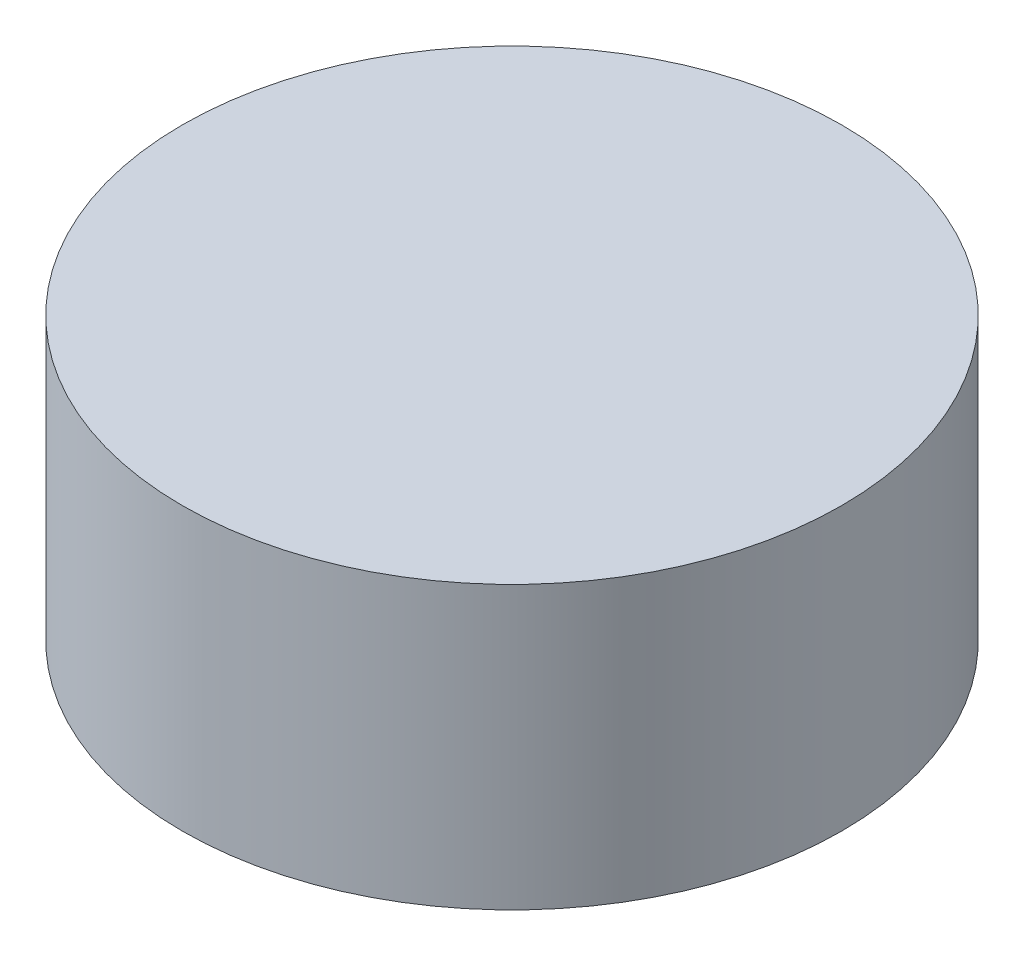
ISO-10303-21;
HEADER;
FILE_DESCRIPTION(('STEP AP214'),'2;1');
FILE_NAME('part.step','',(''),(''),'','','');
FILE_SCHEMA(('AUTOMOTIVE_DESIGN { 1 0 10303 214 1 1 1 1 }'));
ENDSEC;
DATA;
#1=APPLICATION_CONTEXT('core data for automotive mechanical design processes');
#2=APPLICATION_PROTOCOL_DEFINITION('international standard','automotive_design',2000,#1);
#3=PRODUCT_CONTEXT('',#1,'mechanical');
#4=PRODUCT('Part','Part','',(#3));
#5=PRODUCT_RELATED_PRODUCT_CATEGORY('part','',(#4));
#6=PRODUCT_DEFINITION_FORMATION('','',#4);
#7=PRODUCT_DEFINITION_CONTEXT('part definition',#1,'design');
#8=PRODUCT_DEFINITION('design','',#6,#7);
#9=PRODUCT_DEFINITION_SHAPE('','',#8);
#10=(LENGTH_UNIT() NAMED_UNIT(*) SI_UNIT(.MILLI.,.METRE.));
#11=(NAMED_UNIT(*) PLANE_ANGLE_UNIT() SI_UNIT($,.RADIAN.));
#12=(NAMED_UNIT(*) SI_UNIT($,.STERADIAN.) SOLID_ANGLE_UNIT());
#13=UNCERTAINTY_MEASURE_WITH_UNIT(LENGTH_MEASURE(1.E-05),#10,'distance_accuracy_value','');
#14=(GEOMETRIC_REPRESENTATION_CONTEXT(3) GLOBAL_UNCERTAINTY_ASSIGNED_CONTEXT((#13)) GLOBAL_UNIT_ASSIGNED_CONTEXT((#10,
#11,#12)) REPRESENTATION_CONTEXT('',''));
#15=CARTESIAN_POINT('',(0.,0.,0.));
#16=DIRECTION('',(0.,0.,1.));
#17=DIRECTION('',(1.,0.,0.));
#18=AXIS2_PLACEMENT_3D('',#15,#16,#17);
#19=CARTESIAN_POINT('',(-7.391,11.731,-11.173));
#20=DIRECTION('',(0.,-1.,0.));
#21=DIRECTION('',(0.,0.,-1.));
#22=AXIS2_PLACEMENT_3D('',#19,#20,#21);
#23=CYLINDRICAL_SURFACE('',#22,13.719);
#24=CARTESIAN_POINT('',(-7.391,11.731,-11.173));
#25=DIRECTION('',(0.,1.,0.));
#26=DIRECTION('',(0.,0.,1.));
#27=AXIS2_PLACEMENT_3D('',#24,#25,#26);
#28=CIRCLE('',#27,13.719);
#29=CARTESIAN_POINT('',(-7.391,11.731,2.546));
#30=VERTEX_POINT('',#29);
#31=EDGE_CURVE('E10',#30,#30,#28,.T.);
#32=ORIENTED_EDGE('',*,*,#31,.F.);
#33=EDGE_LOOP('',(#32));
#34=FACE_BOUND('',#33,.T.);
#35=CARTESIAN_POINT('',(-7.391,0.,-11.173));
#36=DIRECTION('',(0.,1.,0.));
#37=DIRECTION('',(0.,0.,1.));
#38=AXIS2_PLACEMENT_3D('',#35,#36,#37);
#39=CIRCLE('',#38,13.719);
#40=CARTESIAN_POINT('',(-7.391,0.,2.546));
#41=VERTEX_POINT('',#40);
#42=EDGE_CURVE('E45',#41,#41,#39,.T.);
#43=ORIENTED_EDGE('',*,*,#42,.T.);
#44=EDGE_LOOP('',(#43));
#45=FACE_BOUND('',#44,.T.);
#46=ADVANCED_FACE('F39',(#34,#45),#23,.T.);
#47=CARTESIAN_POINT('',(-7.391,11.731,-11.173));
#48=DIRECTION('',(0.,1.,0.));
#49=DIRECTION('',(0.,0.,1.));
#50=AXIS2_PLACEMENT_3D('',#47,#48,#49);
#51=PLANE('',#50);
#52=ORIENTED_EDGE('',*,*,#31,.T.);
#53=EDGE_LOOP('',(#52));
#54=FACE_BOUND('',#53,.T.);
#55=ADVANCED_FACE('F53',(#54),#51,.T.);
#56=CARTESIAN_POINT('',(-7.391,0.,-11.173));
#57=DIRECTION('',(0.,1.,0.));
#58=DIRECTION('',(0.,0.,1.));
#59=AXIS2_PLACEMENT_3D('',#56,#57,#58);
#60=PLANE('',#59);
#61=ORIENTED_EDGE('',*,*,#42,.F.);
#62=EDGE_LOOP('',(#61));
#63=FACE_BOUND('',#62,.T.);
#64=ADVANCED_FACE('F55',(#63),#60,.F.);
#65=CLOSED_SHELL('',(#46,#55,#64));
#66=MANIFOLD_SOLID_BREP('B2',#65);
#67=ADVANCED_BREP_SHAPE_REPRESENTATION('',(#18,#66),#14);
#68=SHAPE_DEFINITION_REPRESENTATION(#9,#67);
ENDSEC;
END-ISO-10303-21;
